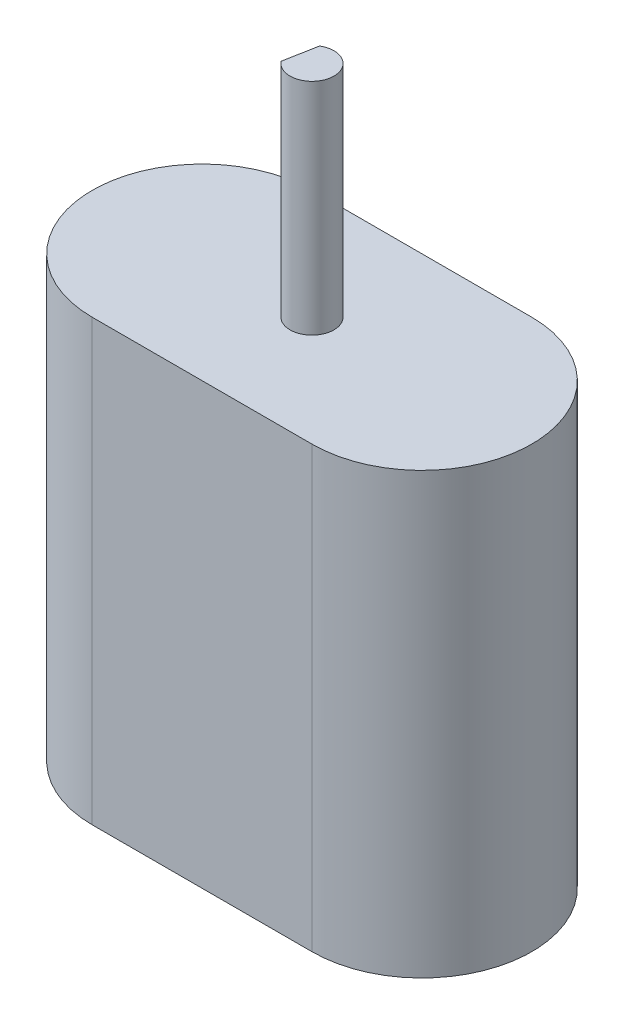
ISO-10303-21;
HEADER;
FILE_DESCRIPTION(('STEP AP214'),'2;1');
FILE_NAME('part.step','',(''),(''),'','','');
FILE_SCHEMA(('AUTOMOTIVE_DESIGN { 1 0 10303 214 1 1 1 1 }'));
ENDSEC;
DATA;
#1=APPLICATION_CONTEXT('core data for automotive mechanical design processes');
#2=APPLICATION_PROTOCOL_DEFINITION('international standard','automotive_design',2000,#1);
#3=PRODUCT_CONTEXT('',#1,'mechanical');
#4=PRODUCT('Part','Part','',(#3));
#5=PRODUCT_RELATED_PRODUCT_CATEGORY('part','',(#4));
#6=PRODUCT_DEFINITION_FORMATION('','',#4);
#7=PRODUCT_DEFINITION_CONTEXT('part definition',#1,'design');
#8=PRODUCT_DEFINITION('design','',#6,#7);
#9=PRODUCT_DEFINITION_SHAPE('','',#8);
#10=(LENGTH_UNIT() NAMED_UNIT(*) SI_UNIT(.MILLI.,.METRE.));
#11=(NAMED_UNIT(*) PLANE_ANGLE_UNIT() SI_UNIT($,.RADIAN.));
#12=(NAMED_UNIT(*) SI_UNIT($,.STERADIAN.) SOLID_ANGLE_UNIT());
#13=UNCERTAINTY_MEASURE_WITH_UNIT(LENGTH_MEASURE(1.E-05),#10,'distance_accuracy_value','');
#14=(GEOMETRIC_REPRESENTATION_CONTEXT(3) GLOBAL_UNCERTAINTY_ASSIGNED_CONTEXT((#13)) GLOBAL_UNIT_ASSIGNED_CONTEXT((#10,
#11,#12)) REPRESENTATION_CONTEXT('',''));
#15=CARTESIAN_POINT('',(0.,0.,0.));
#16=DIRECTION('',(0.,0.,1.));
#17=DIRECTION('',(1.,0.,0.));
#18=AXIS2_PLACEMENT_3D('',#15,#16,#17);
#19=CARTESIAN_POINT('',(0.,20.,0.));
#20=DIRECTION('',(0.,-1.,0.));
#21=DIRECTION('',(0.,0.,-1.));
#22=AXIS2_PLACEMENT_3D('',#19,#20,#21);
#23=CYLINDRICAL_SURFACE('',#22,5.);
#24=CARTESIAN_POINT('',(0.,0.,0.));
#25=DIRECTION('',(0.,1.,0.));
#26=DIRECTION('',(0.,0.,1.));
#27=AXIS2_PLACEMENT_3D('',#24,#25,#26);
#28=CIRCLE('',#27,5.);
#29=CARTESIAN_POINT('',(0.,0.,-5.));
#30=VERTEX_POINT('',#29);
#31=CARTESIAN_POINT('',(0.,0.,5.));
#32=VERTEX_POINT('',#31);
#33=EDGE_CURVE('E126',#30,#32,#28,.T.);
#34=ORIENTED_EDGE('',*,*,#33,.T.);
#35=DIRECTION('',(0.,-1.,0.));
#36=VECTOR('',#35,1.);
#37=CARTESIAN_POINT('',(0.,20.,5.));
#38=LINE('',#37,#36);
#39=CARTESIAN_POINT('',(0.,20.,5.));
#40=VERTEX_POINT('',#39);
#41=EDGE_CURVE('E11',#40,#32,#38,.T.);
#42=ORIENTED_EDGE('',*,*,#41,.F.);
#43=CARTESIAN_POINT('',(0.,20.,0.));
#44=DIRECTION('',(0.,1.,0.));
#45=DIRECTION('',(0.,0.,1.));
#46=AXIS2_PLACEMENT_3D('',#43,#44,#45);
#47=CIRCLE('',#46,5.);
#48=CARTESIAN_POINT('',(0.,20.,-5.));
#49=VERTEX_POINT('',#48);
#50=EDGE_CURVE('E130',#49,#40,#47,.T.);
#51=ORIENTED_EDGE('',*,*,#50,.F.);
#52=DIRECTION('',(0.,-1.,0.));
#53=VECTOR('',#52,1.);
#54=CARTESIAN_POINT('',(0.,20.,-5.));
#55=LINE('',#54,#53);
#56=EDGE_CURVE('E140',#49,#30,#55,.T.);
#57=ORIENTED_EDGE('',*,*,#56,.T.);
#58=EDGE_LOOP('',(#34,#42,#51,#57));
#59=FACE_BOUND('',#58,.T.);
#60=ADVANCED_FACE('F43',(#59),#23,.T.);
#61=CARTESIAN_POINT('',(0.,20.,5.));
#62=DIRECTION('',(0.,0.,-1.));
#63=DIRECTION('',(-1.,0.,0.));
#64=AXIS2_PLACEMENT_3D('',#61,#62,#63);
#65=PLANE('',#64);
#66=DIRECTION('',(1.,0.,0.));
#67=VECTOR('',#66,1.);
#68=CARTESIAN_POINT('',(0.,0.,5.));
#69=LINE('',#68,#67);
#70=CARTESIAN_POINT('',(10.,0.,5.));
#71=VERTEX_POINT('',#70);
#72=EDGE_CURVE('E144',#32,#71,#69,.T.);
#73=ORIENTED_EDGE('',*,*,#72,.T.);
#74=DIRECTION('',(0.,-1.,0.));
#75=VECTOR('',#74,1.);
#76=CARTESIAN_POINT('',(10.,20.,5.));
#77=LINE('',#76,#75);
#78=CARTESIAN_POINT('',(10.,20.,5.));
#79=VERTEX_POINT('',#78);
#80=EDGE_CURVE('E51',#79,#71,#77,.T.);
#81=ORIENTED_EDGE('',*,*,#80,.F.);
#82=DIRECTION('',(1.,0.,0.));
#83=VECTOR('',#82,1.);
#84=CARTESIAN_POINT('',(0.,20.,5.));
#85=LINE('',#84,#83);
#86=EDGE_CURVE('E95',#40,#79,#85,.T.);
#87=ORIENTED_EDGE('',*,*,#86,.F.);
#88=ORIENTED_EDGE('',*,*,#41,.T.);
#89=EDGE_LOOP('',(#73,#81,#87,#88));
#90=FACE_BOUND('',#89,.T.);
#91=ADVANCED_FACE('F177',(#90),#65,.F.);
#92=CARTESIAN_POINT('',(10.,20.,0.));
#93=DIRECTION('',(0.,-1.,0.));
#94=DIRECTION('',(0.,0.,-1.));
#95=AXIS2_PLACEMENT_3D('',#92,#93,#94);
#96=CYLINDRICAL_SURFACE('',#95,5.);
#97=CARTESIAN_POINT('',(10.,0.,0.));
#98=DIRECTION('',(0.,1.,0.));
#99=DIRECTION('',(0.,0.,1.));
#100=AXIS2_PLACEMENT_3D('',#97,#98,#99);
#101=CIRCLE('',#100,5.);
#102=CARTESIAN_POINT('',(10.,0.,-5.));
#103=VERTEX_POINT('',#102);
#104=EDGE_CURVE('E147',#71,#103,#101,.T.);
#105=ORIENTED_EDGE('',*,*,#104,.T.);
#106=DIRECTION('',(0.,-1.,0.));
#107=VECTOR('',#106,1.);
#108=CARTESIAN_POINT('',(10.,20.,-5.));
#109=LINE('',#108,#107);
#110=CARTESIAN_POINT('',(10.,20.,-5.));
#111=VERTEX_POINT('',#110);
#112=EDGE_CURVE('E154',#111,#103,#109,.T.);
#113=ORIENTED_EDGE('',*,*,#112,.F.);
#114=CARTESIAN_POINT('',(10.,20.,0.));
#115=DIRECTION('',(0.,1.,0.));
#116=DIRECTION('',(0.,0.,1.));
#117=AXIS2_PLACEMENT_3D('',#114,#115,#116);
#118=CIRCLE('',#117,5.);
#119=EDGE_CURVE('E135',#79,#111,#118,.T.);
#120=ORIENTED_EDGE('',*,*,#119,.F.);
#121=ORIENTED_EDGE('',*,*,#80,.T.);
#122=EDGE_LOOP('',(#105,#113,#120,#121));
#123=FACE_BOUND('',#122,.T.);
#124=ADVANCED_FACE('F161',(#123),#96,.T.);
#125=CARTESIAN_POINT('',(0.,20.,-5.));
#126=DIRECTION('',(0.,0.,1.));
#127=DIRECTION('',(1.,0.,0.));
#128=AXIS2_PLACEMENT_3D('',#125,#126,#127);
#129=PLANE('',#128);
#130=DIRECTION('',(-1.,0.,0.));
#131=VECTOR('',#130,1.);
#132=CARTESIAN_POINT('',(0.,0.,-5.));
#133=LINE('',#132,#131);
#134=EDGE_CURVE('E88',#103,#30,#133,.T.);
#135=ORIENTED_EDGE('',*,*,#134,.T.);
#136=ORIENTED_EDGE('',*,*,#56,.F.);
#137=DIRECTION('',(-1.,0.,0.));
#138=VECTOR('',#137,1.);
#139=CARTESIAN_POINT('',(0.,20.,-5.));
#140=LINE('',#139,#138);
#141=EDGE_CURVE('E67',#111,#49,#140,.T.);
#142=ORIENTED_EDGE('',*,*,#141,.F.);
#143=ORIENTED_EDGE('',*,*,#112,.T.);
#144=EDGE_LOOP('',(#135,#136,#142,#143));
#145=FACE_BOUND('',#144,.T.);
#146=ADVANCED_FACE('F169',(#145),#129,.F.);
#147=CARTESIAN_POINT('',(0.,20.,0.));
#148=DIRECTION('',(0.,1.,0.));
#149=DIRECTION('',(0.,0.,1.));
#150=AXIS2_PLACEMENT_3D('',#147,#148,#149);
#151=PLANE('',#150);
#152=CARTESIAN_POINT('',(5.00000000000001,20.,0.));
#153=DIRECTION('',(0.,1.,0.));
#154=DIRECTION('',(0.,0.,1.));
#155=AXIS2_PLACEMENT_3D('',#152,#153,#154);
#156=CIRCLE('',#155,1.);
#157=CARTESIAN_POINT('',(4.21137814229481,20.,0.614878496574398));
#158=VERTEX_POINT('',#157);
#159=CARTESIAN_POINT('',(4.48852188654174,20.,-0.859296304805952));
#160=VERTEX_POINT('',#159);
#161=EDGE_CURVE('E116',#158,#160,#156,.T.);
#162=ORIENTED_EDGE('',*,*,#161,.F.);
#163=DIRECTION('',(0.18476249616462,0.,-0.982783200920233));
#164=VECTOR('',#163,1.);
#165=CARTESIAN_POINT('',(4.48852188654174,20.,-0.859296304805952));
#166=LINE('',#165,#164);
#167=EDGE_CURVE('E103',#158,#160,#166,.T.);
#168=ORIENTED_EDGE('',*,*,#167,.T.);
#169=EDGE_LOOP('',(#162,#168));
#170=FACE_BOUND('',#169,.T.);
#171=ORIENTED_EDGE('',*,*,#50,.T.);
#172=ORIENTED_EDGE('',*,*,#86,.T.);
#173=ORIENTED_EDGE('',*,*,#119,.T.);
#174=ORIENTED_EDGE('',*,*,#141,.T.);
#175=EDGE_LOOP('',(#171,#172,#173,#174));
#176=FACE_BOUND('',#175,.T.);
#177=ADVANCED_FACE('F121',(#170,#176),#151,.T.);
#178=CARTESIAN_POINT('',(0.,0.,0.));
#179=DIRECTION('',(0.,1.,0.));
#180=DIRECTION('',(0.,0.,1.));
#181=AXIS2_PLACEMENT_3D('',#178,#179,#180);
#182=PLANE('',#181);
#183=ORIENTED_EDGE('',*,*,#33,.F.);
#184=ORIENTED_EDGE('',*,*,#134,.F.);
#185=ORIENTED_EDGE('',*,*,#104,.F.);
#186=ORIENTED_EDGE('',*,*,#72,.F.);
#187=EDGE_LOOP('',(#183,#184,#185,#186));
#188=FACE_BOUND('',#187,.T.);
#189=ADVANCED_FACE('F165',(#188),#182,.F.);
#190=CARTESIAN_POINT('',(5.00000000000001,30.,0.));
#191=DIRECTION('',(0.,-1.,0.));
#192=DIRECTION('',(0.,0.,-1.));
#193=AXIS2_PLACEMENT_3D('',#190,#191,#192);
#194=CYLINDRICAL_SURFACE('',#193,1.);
#195=CARTESIAN_POINT('',(5.00000000000001,30.,0.));
#196=DIRECTION('',(0.,1.,0.));
#197=DIRECTION('',(0.,0.,1.));
#198=AXIS2_PLACEMENT_3D('',#195,#196,#197);
#199=CIRCLE('',#198,1.);
#200=CARTESIAN_POINT('',(4.21137814229481,30.,0.614878496574398));
#201=VERTEX_POINT('',#200);
#202=CARTESIAN_POINT('',(4.48852188654174,30.,-0.859296304805952));
#203=VERTEX_POINT('',#202);
#204=EDGE_CURVE('E118',#201,#203,#199,.T.);
#205=ORIENTED_EDGE('',*,*,#204,.F.);
#206=DIRECTION('',(0.,1.,0.));
#207=VECTOR('',#206,1.);
#208=CARTESIAN_POINT('',(4.21137814229481,20.,0.614878496574398));
#209=LINE('',#208,#207);
#210=EDGE_CURVE('E58',#158,#201,#209,.T.);
#211=ORIENTED_EDGE('',*,*,#210,.F.);
#212=ORIENTED_EDGE('',*,*,#161,.T.);
#213=DIRECTION('',(0.,1.,0.));
#214=VECTOR('',#213,1.);
#215=CARTESIAN_POINT('',(4.48852188654174,20.,-0.859296304805952));
#216=LINE('',#215,#214);
#217=EDGE_CURVE('E106',#160,#203,#216,.T.);
#218=ORIENTED_EDGE('',*,*,#217,.T.);
#219=EDGE_LOOP('',(#205,#211,#212,#218));
#220=FACE_BOUND('',#219,.T.);
#221=ADVANCED_FACE('F115',(#220),#194,.T.);
#222=CARTESIAN_POINT('',(5.00000000000001,30.,0.));
#223=DIRECTION('',(0.,1.,0.));
#224=DIRECTION('',(0.,0.,1.));
#225=AXIS2_PLACEMENT_3D('',#222,#223,#224);
#226=PLANE('',#225);
#227=DIRECTION('',(0.18476249616462,0.,-0.982783200920233));
#228=VECTOR('',#227,1.);
#229=CARTESIAN_POINT('',(4.48852188654174,30.,-0.859296304805952));
#230=LINE('',#229,#228);
#231=EDGE_CURVE('E111',#201,#203,#230,.T.);
#232=ORIENTED_EDGE('',*,*,#231,.F.);
#233=ORIENTED_EDGE('',*,*,#204,.T.);
#234=EDGE_LOOP('',(#232,#233));
#235=FACE_BOUND('',#234,.T.);
#236=ADVANCED_FACE('F222',(#235),#226,.T.);
#237=CARTESIAN_POINT('',(4.48852188654174,20.,-0.859296304805952));
#238=DIRECTION('',(0.982783200920233,0.,0.18476249616462));
#239=DIRECTION('',(0.18476249616462,0.,-0.982783200920233));
#240=AXIS2_PLACEMENT_3D('',#237,#238,#239);
#241=PLANE('',#240);
#242=ORIENTED_EDGE('',*,*,#231,.T.);
#243=ORIENTED_EDGE('',*,*,#217,.F.);
#244=ORIENTED_EDGE('',*,*,#167,.F.);
#245=ORIENTED_EDGE('',*,*,#210,.T.);
#246=EDGE_LOOP('',(#242,#243,#244,#245));
#247=FACE_BOUND('',#246,.T.);
#248=ADVANCED_FACE('F104',(#247),#241,.F.);
#249=CLOSED_SHELL('',(#60,#91,#124,#146,#177,#189,#221,#236,#248));
#250=MANIFOLD_SOLID_BREP('B2',#249);
#251=ADVANCED_BREP_SHAPE_REPRESENTATION('',(#18,#250),#14);
#252=SHAPE_DEFINITION_REPRESENTATION(#9,#251);
ENDSEC;
END-ISO-10303-21;
